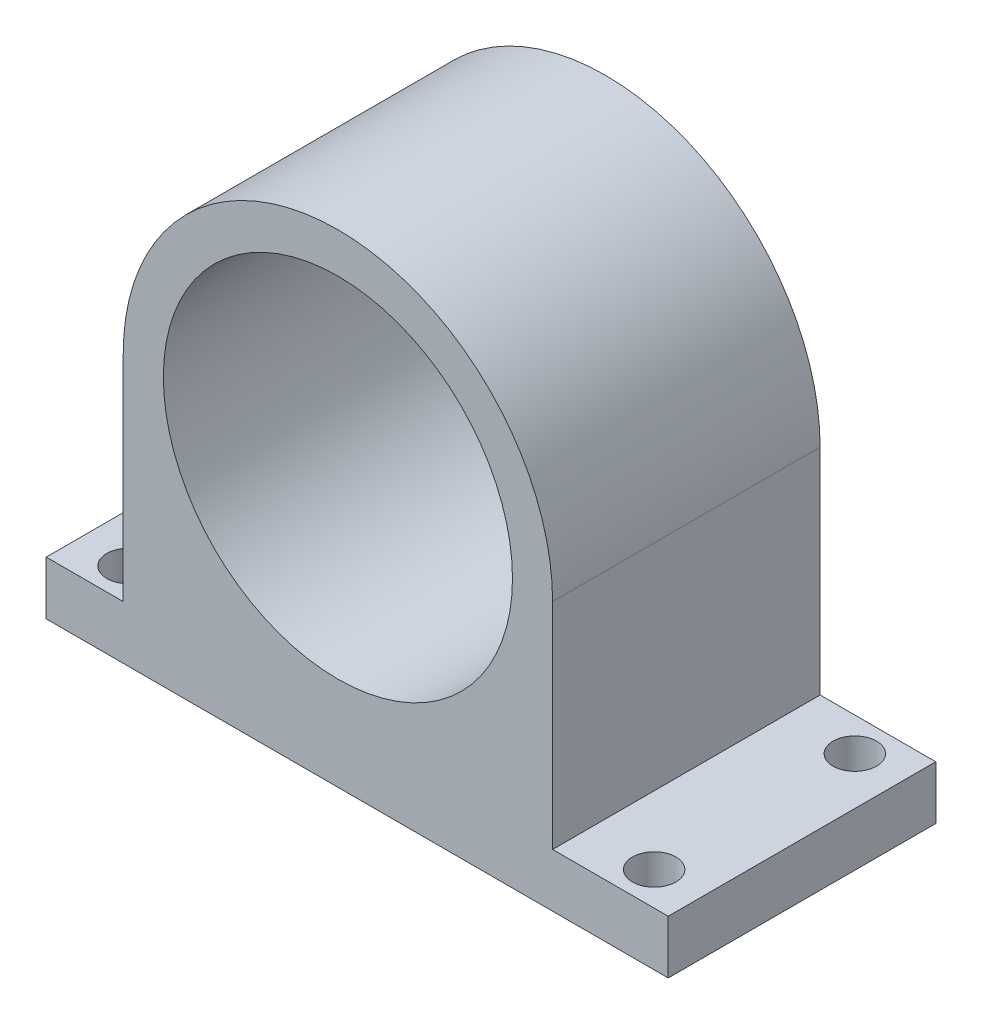
ISO-10303-21;
HEADER;
FILE_DESCRIPTION(('STEP AP214'),'2;1');
FILE_NAME('part.step','',(''),(''),'','','');
FILE_SCHEMA(('AUTOMOTIVE_DESIGN { 1 0 10303 214 1 1 1 1 }'));
ENDSEC;
DATA;
#1=APPLICATION_CONTEXT('core data for automotive mechanical design processes');
#2=APPLICATION_PROTOCOL_DEFINITION('international standard','automotive_design',2000,#1);
#3=PRODUCT_CONTEXT('',#1,'mechanical');
#4=PRODUCT('Part','Part','',(#3));
#5=PRODUCT_RELATED_PRODUCT_CATEGORY('part','',(#4));
#6=PRODUCT_DEFINITION_FORMATION('','',#4);
#7=PRODUCT_DEFINITION_CONTEXT('part definition',#1,'design');
#8=PRODUCT_DEFINITION('design','',#6,#7);
#9=PRODUCT_DEFINITION_SHAPE('','',#8);
#10=(LENGTH_UNIT() NAMED_UNIT(*) SI_UNIT(.MILLI.,.METRE.));
#11=(NAMED_UNIT(*) PLANE_ANGLE_UNIT() SI_UNIT($,.RADIAN.));
#12=(NAMED_UNIT(*) SI_UNIT($,.STERADIAN.) SOLID_ANGLE_UNIT());
#13=UNCERTAINTY_MEASURE_WITH_UNIT(LENGTH_MEASURE(1.E-05),#10,'distance_accuracy_value','');
#14=(GEOMETRIC_REPRESENTATION_CONTEXT(3) GLOBAL_UNCERTAINTY_ASSIGNED_CONTEXT((#13)) GLOBAL_UNIT_ASSIGNED_CONTEXT((#10,
#11,#12)) REPRESENTATION_CONTEXT('',''));
#15=CARTESIAN_POINT('',(0.,0.,0.));
#16=DIRECTION('',(0.,0.,1.));
#17=DIRECTION('',(1.,0.,0.));
#18=AXIS2_PLACEMENT_3D('',#15,#16,#17);
#19=CARTESIAN_POINT('',(0.,0.,40.));
#20=DIRECTION('',(0.,0.,1.));
#21=DIRECTION('',(1.,0.,0.));
#22=AXIS2_PLACEMENT_3D('',#19,#20,#21);
#23=PLANE('',#22);
#24=DIRECTION('',(0.,-1.,0.));
#25=VECTOR('',#24,1.);
#26=CARTESIAN_POINT('',(-43.6113587860518,-32.1,40.));
#27=LINE('',#26,#25);
#28=CARTESIAN_POINT('',(-43.6113587860518,-32.1,40.));
#29=VERTEX_POINT('',#28);
#30=CARTESIAN_POINT('',(-43.6113587860518,-40.1,40.));
#31=VERTEX_POINT('',#30);
#32=EDGE_CURVE('E145',#29,#31,#27,.T.);
#33=ORIENTED_EDGE('',*,*,#32,.T.);
#34=DIRECTION('',(1.,0.,0.));
#35=VECTOR('',#34,1.);
#36=CARTESIAN_POINT('',(-43.6113587860518,-40.1,40.));
#37=LINE('',#36,#35);
#38=CARTESIAN_POINT('',(49.3886412139482,-40.1,40.));
#39=VERTEX_POINT('',#38);
#40=EDGE_CURVE('E93',#31,#39,#37,.T.);
#41=ORIENTED_EDGE('',*,*,#40,.T.);
#42=DIRECTION('',(0.,1.,0.));
#43=VECTOR('',#42,1.);
#44=CARTESIAN_POINT('',(49.3886412139482,-32.1,40.));
#45=LINE('',#44,#43);
#46=CARTESIAN_POINT('',(49.3886412139482,-32.1,40.));
#47=VERTEX_POINT('',#46);
#48=EDGE_CURVE('E160',#39,#47,#45,.T.);
#49=ORIENTED_EDGE('',*,*,#48,.T.);
#50=DIRECTION('',(-1.,0.,0.));
#51=VECTOR('',#50,1.);
#52=CARTESIAN_POINT('',(32.1,-32.1,40.));
#53=LINE('',#52,#51);
#54=CARTESIAN_POINT('',(32.1,-32.1,40.));
#55=VERTEX_POINT('',#54);
#56=EDGE_CURVE('E173',#47,#55,#53,.T.);
#57=ORIENTED_EDGE('',*,*,#56,.T.);
#58=DIRECTION('',(0.,1.,0.));
#59=VECTOR('',#58,1.);
#60=CARTESIAN_POINT('',(32.1,0.,40.));
#61=LINE('',#60,#59);
#62=CARTESIAN_POINT('',(32.1,0.,40.));
#63=VERTEX_POINT('',#62);
#64=EDGE_CURVE('E112',#55,#63,#61,.T.);
#65=ORIENTED_EDGE('',*,*,#64,.T.);
#66=CARTESIAN_POINT('',(0.,0.,40.));
#67=DIRECTION('',(0.,0.,1.));
#68=DIRECTION('',(1.,0.,0.));
#69=AXIS2_PLACEMENT_3D('',#66,#67,#68);
#70=CIRCLE('',#69,32.1);
#71=CARTESIAN_POINT('',(-32.1,0.,40.));
#72=VERTEX_POINT('',#71);
#73=EDGE_CURVE('E106',#63,#72,#70,.T.);
#74=ORIENTED_EDGE('',*,*,#73,.T.);
#75=DIRECTION('',(0.,-1.,0.));
#76=VECTOR('',#75,1.);
#77=CARTESIAN_POINT('',(-32.1,0.,40.));
#78=LINE('',#77,#76);
#79=CARTESIAN_POINT('',(-32.1,-32.1,40.));
#80=VERTEX_POINT('',#79);
#81=EDGE_CURVE('E110',#72,#80,#78,.T.);
#82=ORIENTED_EDGE('',*,*,#81,.T.);
#83=DIRECTION('',(-1.,0.,0.));
#84=VECTOR('',#83,1.);
#85=CARTESIAN_POINT('',(-43.6113587860518,-32.1,40.));
#86=LINE('',#85,#84);
#87=EDGE_CURVE('E50',#80,#29,#86,.T.);
#88=ORIENTED_EDGE('',*,*,#87,.T.);
#89=EDGE_LOOP('',(#33,#41,#49,#57,#65,#74,#82,#88));
#90=FACE_BOUND('',#89,.T.);
#91=CARTESIAN_POINT('',(0.,0.,40.));
#92=DIRECTION('',(0.,0.,1.));
#93=DIRECTION('',(1.,0.,0.));
#94=AXIS2_PLACEMENT_3D('',#91,#92,#93);
#95=CIRCLE('',#94,26.1);
#96=CARTESIAN_POINT('',(26.1,0.,40.));
#97=VERTEX_POINT('',#96);
#98=EDGE_CURVE('E134',#97,#97,#95,.T.);
#99=ORIENTED_EDGE('',*,*,#98,.F.);
#100=EDGE_LOOP('',(#99));
#101=FACE_BOUND('',#100,.T.);
#102=ADVANCED_FACE('F33',(#90,#101),#23,.T.);
#103=CARTESIAN_POINT('',(0.,0.,0.));
#104=DIRECTION('',(0.,0.,1.));
#105=DIRECTION('',(1.,0.,0.));
#106=AXIS2_PLACEMENT_3D('',#103,#104,#105);
#107=PLANE('',#106);
#108=DIRECTION('',(0.,-1.,0.));
#109=VECTOR('',#108,1.);
#110=CARTESIAN_POINT('',(-43.6113587860518,-32.1,0.));
#111=LINE('',#110,#109);
#112=CARTESIAN_POINT('',(-43.6113587860518,-32.1,0.));
#113=VERTEX_POINT('',#112);
#114=CARTESIAN_POINT('',(-43.6113587860518,-40.1,0.));
#115=VERTEX_POINT('',#114);
#116=EDGE_CURVE('E130',#113,#115,#111,.T.);
#117=ORIENTED_EDGE('',*,*,#116,.F.);
#118=DIRECTION('',(-1.,0.,0.));
#119=VECTOR('',#118,1.);
#120=CARTESIAN_POINT('',(-43.6113587860518,-32.1,0.));
#121=LINE('',#120,#119);
#122=CARTESIAN_POINT('',(-32.1,-32.1,0.));
#123=VERTEX_POINT('',#122);
#124=EDGE_CURVE('E85',#123,#113,#121,.T.);
#125=ORIENTED_EDGE('',*,*,#124,.F.);
#126=DIRECTION('',(0.,-1.,0.));
#127=VECTOR('',#126,1.);
#128=CARTESIAN_POINT('',(-32.1,0.,0.));
#129=LINE('',#128,#127);
#130=CARTESIAN_POINT('',(-32.1,0.,0.));
#131=VERTEX_POINT('',#130);
#132=EDGE_CURVE('E79',#131,#123,#129,.T.);
#133=ORIENTED_EDGE('',*,*,#132,.F.);
#134=CARTESIAN_POINT('',(0.,0.,0.));
#135=DIRECTION('',(0.,0.,1.));
#136=DIRECTION('',(1.,0.,0.));
#137=AXIS2_PLACEMENT_3D('',#134,#135,#136);
#138=CIRCLE('',#137,32.1);
#139=CARTESIAN_POINT('',(32.1,0.,0.));
#140=VERTEX_POINT('',#139);
#141=EDGE_CURVE('E120',#140,#131,#138,.T.);
#142=ORIENTED_EDGE('',*,*,#141,.F.);
#143=DIRECTION('',(0.,1.,0.));
#144=VECTOR('',#143,1.);
#145=CARTESIAN_POINT('',(32.1,0.,0.));
#146=LINE('',#145,#144);
#147=CARTESIAN_POINT('',(32.1,-32.1,0.));
#148=VERTEX_POINT('',#147);
#149=EDGE_CURVE('E140',#148,#140,#146,.T.);
#150=ORIENTED_EDGE('',*,*,#149,.F.);
#151=DIRECTION('',(-1.,0.,0.));
#152=VECTOR('',#151,1.);
#153=CARTESIAN_POINT('',(32.1,-32.1,0.));
#154=LINE('',#153,#152);
#155=CARTESIAN_POINT('',(49.3886412139482,-32.1,0.));
#156=VERTEX_POINT('',#155);
#157=EDGE_CURVE('E138',#156,#148,#154,.T.);
#158=ORIENTED_EDGE('',*,*,#157,.F.);
#159=DIRECTION('',(0.,1.,0.));
#160=VECTOR('',#159,1.);
#161=CARTESIAN_POINT('',(49.3886412139482,-32.1,0.));
#162=LINE('',#161,#160);
#163=CARTESIAN_POINT('',(49.3886412139482,-40.1,0.));
#164=VERTEX_POINT('',#163);
#165=EDGE_CURVE('E136',#164,#156,#162,.T.);
#166=ORIENTED_EDGE('',*,*,#165,.F.);
#167=DIRECTION('',(1.,0.,0.));
#168=VECTOR('',#167,1.);
#169=CARTESIAN_POINT('',(-43.6113587860518,-40.1,0.));
#170=LINE('',#169,#168);
#171=EDGE_CURVE('E133',#115,#164,#170,.T.);
#172=ORIENTED_EDGE('',*,*,#171,.F.);
#173=EDGE_LOOP('',(#117,#125,#133,#142,#150,#158,#166,#172));
#174=FACE_BOUND('',#173,.T.);
#175=CARTESIAN_POINT('',(0.,0.,0.));
#176=DIRECTION('',(0.,0.,1.));
#177=DIRECTION('',(1.,0.,0.));
#178=AXIS2_PLACEMENT_3D('',#175,#176,#177);
#179=CIRCLE('',#178,26.1);
#180=CARTESIAN_POINT('',(26.1,0.,0.));
#181=VERTEX_POINT('',#180);
#182=EDGE_CURVE('E179',#181,#181,#179,.T.);
#183=ORIENTED_EDGE('',*,*,#182,.T.);
#184=EDGE_LOOP('',(#183));
#185=FACE_BOUND('',#184,.T.);
#186=ADVANCED_FACE('F164',(#174,#185),#107,.F.);
#187=CARTESIAN_POINT('',(-43.6113587860518,-32.1,40.));
#188=DIRECTION('',(1.,0.,0.));
#189=DIRECTION('',(0.,0.,-1.));
#190=AXIS2_PLACEMENT_3D('',#187,#188,#189);
#191=PLANE('',#190);
#192=ORIENTED_EDGE('',*,*,#116,.T.);
#193=DIRECTION('',(0.,0.,-1.));
#194=VECTOR('',#193,1.);
#195=CARTESIAN_POINT('',(-43.6113587860518,-40.1,40.));
#196=LINE('',#195,#194);
#197=EDGE_CURVE('E11',#31,#115,#196,.T.);
#198=ORIENTED_EDGE('',*,*,#197,.F.);
#199=ORIENTED_EDGE('',*,*,#32,.F.);
#200=DIRECTION('',(0.,0.,-1.));
#201=VECTOR('',#200,1.);
#202=CARTESIAN_POINT('',(-43.6113587860518,-32.1,40.));
#203=LINE('',#202,#201);
#204=EDGE_CURVE('E126',#29,#113,#203,.T.);
#205=ORIENTED_EDGE('',*,*,#204,.T.);
#206=EDGE_LOOP('',(#192,#198,#199,#205));
#207=FACE_BOUND('',#206,.T.);
#208=ADVANCED_FACE('F35',(#207),#191,.F.);
#209=CARTESIAN_POINT('',(-43.6113587860518,-40.1,40.));
#210=DIRECTION('',(0.,1.,0.));
#211=DIRECTION('',(-1.,0.,0.));
#212=AXIS2_PLACEMENT_3D('',#209,#210,#211);
#213=PLANE('',#212);
#214=CARTESIAN_POINT('',(42.2851581234396,-40.1,5.));
#215=DIRECTION('',(0.,1.,0.));
#216=DIRECTION('',(0.,0.,1.));
#217=AXIS2_PLACEMENT_3D('',#214,#215,#216);
#218=CIRCLE('',#217,3.25);
#219=CARTESIAN_POINT('',(42.2851581234396,-40.1,8.24999999999999));
#220=VERTEX_POINT('',#219);
#221=EDGE_CURVE('E202',#220,#220,#218,.T.);
#222=ORIENTED_EDGE('',*,*,#221,.T.);
#223=EDGE_LOOP('',(#222));
#224=FACE_BOUND('',#223,.T.);
#225=CARTESIAN_POINT('',(42.2851581234396,-40.1,35.));
#226=DIRECTION('',(0.,1.,0.));
#227=DIRECTION('',(0.,0.,1.));
#228=AXIS2_PLACEMENT_3D('',#225,#226,#227);
#229=CIRCLE('',#228,3.25);
#230=CARTESIAN_POINT('',(42.2851581234396,-40.1,38.25));
#231=VERTEX_POINT('',#230);
#232=EDGE_CURVE('E196',#231,#231,#229,.T.);
#233=ORIENTED_EDGE('',*,*,#232,.T.);
#234=EDGE_LOOP('',(#233));
#235=FACE_BOUND('',#234,.T.);
#236=CARTESIAN_POINT('',(-36.3148418765604,-40.1,35.));
#237=DIRECTION('',(0.,1.,0.));
#238=DIRECTION('',(0.,0.,1.));
#239=AXIS2_PLACEMENT_3D('',#236,#237,#238);
#240=CIRCLE('',#239,3.25);
#241=CARTESIAN_POINT('',(-36.3148418765604,-40.1,38.25));
#242=VERTEX_POINT('',#241);
#243=EDGE_CURVE('E190',#242,#242,#240,.T.);
#244=ORIENTED_EDGE('',*,*,#243,.T.);
#245=EDGE_LOOP('',(#244));
#246=FACE_BOUND('',#245,.T.);
#247=CARTESIAN_POINT('',(-36.3148418765604,-40.1,5.));
#248=DIRECTION('',(0.,1.,0.));
#249=DIRECTION('',(0.,0.,1.));
#250=AXIS2_PLACEMENT_3D('',#247,#248,#249);
#251=CIRCLE('',#250,3.25);
#252=CARTESIAN_POINT('',(-36.3148418765604,-40.1,8.25));
#253=VERTEX_POINT('',#252);
#254=EDGE_CURVE('E182',#253,#253,#251,.T.);
#255=ORIENTED_EDGE('',*,*,#254,.T.);
#256=EDGE_LOOP('',(#255));
#257=FACE_BOUND('',#256,.T.);
#258=ORIENTED_EDGE('',*,*,#171,.T.);
#259=DIRECTION('',(0.,0.,-1.));
#260=VECTOR('',#259,1.);
#261=CARTESIAN_POINT('',(49.3886412139482,-40.1,40.));
#262=LINE('',#261,#260);
#263=EDGE_CURVE('E42',#39,#164,#262,.T.);
#264=ORIENTED_EDGE('',*,*,#263,.F.);
#265=ORIENTED_EDGE('',*,*,#40,.F.);
#266=ORIENTED_EDGE('',*,*,#197,.T.);
#267=EDGE_LOOP('',(#258,#264,#265,#266));
#268=FACE_BOUND('',#267,.T.);
#269=ADVANCED_FACE('F252',(#224,#235,#246,#257,#268),#213,.F.);
#270=CARTESIAN_POINT('',(49.3886412139482,-32.1,40.));
#271=DIRECTION('',(-1.,0.,0.));
#272=DIRECTION('',(0.,0.,1.));
#273=AXIS2_PLACEMENT_3D('',#270,#271,#272);
#274=PLANE('',#273);
#275=ORIENTED_EDGE('',*,*,#165,.T.);
#276=DIRECTION('',(0.,0.,-1.));
#277=VECTOR('',#276,1.);
#278=CARTESIAN_POINT('',(49.3886412139482,-32.1,40.));
#279=LINE('',#278,#277);
#280=EDGE_CURVE('E152',#47,#156,#279,.T.);
#281=ORIENTED_EDGE('',*,*,#280,.F.);
#282=ORIENTED_EDGE('',*,*,#48,.F.);
#283=ORIENTED_EDGE('',*,*,#263,.T.);
#284=EDGE_LOOP('',(#275,#281,#282,#283));
#285=FACE_BOUND('',#284,.T.);
#286=ADVANCED_FACE('F158',(#285),#274,.F.);
#287=CARTESIAN_POINT('',(32.1,-32.1,40.));
#288=DIRECTION('',(0.,-1.,0.));
#289=DIRECTION('',(0.,0.,-1.));
#290=AXIS2_PLACEMENT_3D('',#287,#288,#289);
#291=PLANE('',#290);
#292=CARTESIAN_POINT('',(42.2851581234396,-32.1,5.));
#293=DIRECTION('',(0.,1.,0.));
#294=DIRECTION('',(0.,0.,1.));
#295=AXIS2_PLACEMENT_3D('',#292,#293,#294);
#296=CIRCLE('',#295,3.25);
#297=CARTESIAN_POINT('',(42.2851581234396,-32.1,8.25));
#298=VERTEX_POINT('',#297);
#299=EDGE_CURVE('E205',#298,#298,#296,.T.);
#300=ORIENTED_EDGE('',*,*,#299,.F.);
#301=EDGE_LOOP('',(#300));
#302=FACE_BOUND('',#301,.T.);
#303=CARTESIAN_POINT('',(42.2851581234396,-32.1,35.));
#304=DIRECTION('',(0.,1.,0.));
#305=DIRECTION('',(0.,0.,1.));
#306=AXIS2_PLACEMENT_3D('',#303,#304,#305);
#307=CIRCLE('',#306,3.25);
#308=CARTESIAN_POINT('',(42.2851581234396,-32.1,38.25));
#309=VERTEX_POINT('',#308);
#310=EDGE_CURVE('E199',#309,#309,#307,.T.);
#311=ORIENTED_EDGE('',*,*,#310,.F.);
#312=EDGE_LOOP('',(#311));
#313=FACE_BOUND('',#312,.T.);
#314=ORIENTED_EDGE('',*,*,#157,.T.);
#315=DIRECTION('',(0.,0.,-1.));
#316=VECTOR('',#315,1.);
#317=CARTESIAN_POINT('',(32.1,-32.1,40.));
#318=LINE('',#317,#316);
#319=EDGE_CURVE('E149',#55,#148,#318,.T.);
#320=ORIENTED_EDGE('',*,*,#319,.F.);
#321=ORIENTED_EDGE('',*,*,#56,.F.);
#322=ORIENTED_EDGE('',*,*,#280,.T.);
#323=EDGE_LOOP('',(#314,#320,#321,#322));
#324=FACE_BOUND('',#323,.T.);
#325=ADVANCED_FACE('F169',(#302,#313,#324),#291,.F.);
#326=CARTESIAN_POINT('',(32.1,0.,40.));
#327=DIRECTION('',(-1.,0.,0.));
#328=DIRECTION('',(0.,-1.,0.));
#329=AXIS2_PLACEMENT_3D('',#326,#327,#328);
#330=PLANE('',#329);
#331=ORIENTED_EDGE('',*,*,#149,.T.);
#332=DIRECTION('',(0.,0.,-1.));
#333=VECTOR('',#332,1.);
#334=CARTESIAN_POINT('',(32.1,0.,40.));
#335=LINE('',#334,#333);
#336=EDGE_CURVE('E121',#63,#140,#335,.T.);
#337=ORIENTED_EDGE('',*,*,#336,.F.);
#338=ORIENTED_EDGE('',*,*,#64,.F.);
#339=ORIENTED_EDGE('',*,*,#319,.T.);
#340=EDGE_LOOP('',(#331,#337,#338,#339));
#341=FACE_BOUND('',#340,.T.);
#342=ADVANCED_FACE('F172',(#341),#330,.F.);
#343=CARTESIAN_POINT('',(0.,0.,40.));
#344=DIRECTION('',(0.,0.,-1.));
#345=DIRECTION('',(-1.,0.,0.));
#346=AXIS2_PLACEMENT_3D('',#343,#344,#345);
#347=CYLINDRICAL_SURFACE('',#346,32.1);
#348=ORIENTED_EDGE('',*,*,#141,.T.);
#349=DIRECTION('',(0.,0.,-1.));
#350=VECTOR('',#349,1.);
#351=CARTESIAN_POINT('',(-32.1,0.,40.));
#352=LINE('',#351,#350);
#353=EDGE_CURVE('E117',#72,#131,#352,.T.);
#354=ORIENTED_EDGE('',*,*,#353,.F.);
#355=ORIENTED_EDGE('',*,*,#73,.F.);
#356=ORIENTED_EDGE('',*,*,#336,.T.);
#357=EDGE_LOOP('',(#348,#354,#355,#356));
#358=FACE_BOUND('',#357,.T.);
#359=ADVANCED_FACE('F118',(#358),#347,.T.);
#360=CARTESIAN_POINT('',(-32.1,0.,40.));
#361=DIRECTION('',(1.,0.,0.));
#362=DIRECTION('',(0.,0.,-1.));
#363=AXIS2_PLACEMENT_3D('',#360,#361,#362);
#364=PLANE('',#363);
#365=ORIENTED_EDGE('',*,*,#132,.T.);
#366=DIRECTION('',(0.,0.,-1.));
#367=VECTOR('',#366,1.);
#368=CARTESIAN_POINT('',(-32.1,-32.1,40.));
#369=LINE('',#368,#367);
#370=EDGE_CURVE('E122',#80,#123,#369,.T.);
#371=ORIENTED_EDGE('',*,*,#370,.F.);
#372=ORIENTED_EDGE('',*,*,#81,.F.);
#373=ORIENTED_EDGE('',*,*,#353,.T.);
#374=EDGE_LOOP('',(#365,#371,#372,#373));
#375=FACE_BOUND('',#374,.T.);
#376=ADVANCED_FACE('F124',(#375),#364,.F.);
#377=CARTESIAN_POINT('',(-43.6113587860518,-32.1,40.));
#378=DIRECTION('',(0.,-1.,0.));
#379=DIRECTION('',(0.,0.,-1.));
#380=AXIS2_PLACEMENT_3D('',#377,#378,#379);
#381=PLANE('',#380);
#382=CARTESIAN_POINT('',(-36.3148418765604,-32.1,35.));
#383=DIRECTION('',(0.,1.,0.));
#384=DIRECTION('',(0.,0.,1.));
#385=AXIS2_PLACEMENT_3D('',#382,#383,#384);
#386=CIRCLE('',#385,3.25);
#387=CARTESIAN_POINT('',(-36.3148418765604,-32.1,38.25));
#388=VERTEX_POINT('',#387);
#389=EDGE_CURVE('E193',#388,#388,#386,.T.);
#390=ORIENTED_EDGE('',*,*,#389,.F.);
#391=EDGE_LOOP('',(#390));
#392=FACE_BOUND('',#391,.T.);
#393=CARTESIAN_POINT('',(-36.3148418765604,-32.1,5.));
#394=DIRECTION('',(0.,1.,0.));
#395=DIRECTION('',(0.,0.,1.));
#396=AXIS2_PLACEMENT_3D('',#393,#394,#395);
#397=CIRCLE('',#396,3.25);
#398=CARTESIAN_POINT('',(-36.3148418765604,-32.1,8.25000000000001));
#399=VERTEX_POINT('',#398);
#400=EDGE_CURVE('E187',#399,#399,#397,.T.);
#401=ORIENTED_EDGE('',*,*,#400,.F.);
#402=EDGE_LOOP('',(#401));
#403=FACE_BOUND('',#402,.T.);
#404=ORIENTED_EDGE('',*,*,#124,.T.);
#405=ORIENTED_EDGE('',*,*,#204,.F.);
#406=ORIENTED_EDGE('',*,*,#87,.F.);
#407=ORIENTED_EDGE('',*,*,#370,.T.);
#408=EDGE_LOOP('',(#404,#405,#406,#407));
#409=FACE_BOUND('',#408,.T.);
#410=ADVANCED_FACE('F241',(#392,#403,#409),#381,.F.);
#411=CARTESIAN_POINT('',(0.,0.,40.));
#412=DIRECTION('',(0.,0.,-1.));
#413=DIRECTION('',(-1.,0.,0.));
#414=AXIS2_PLACEMENT_3D('',#411,#412,#413);
#415=CYLINDRICAL_SURFACE('',#414,26.1);
#416=ORIENTED_EDGE('',*,*,#98,.T.);
#417=EDGE_LOOP('',(#416));
#418=FACE_BOUND('',#417,.T.);
#419=ORIENTED_EDGE('',*,*,#182,.F.);
#420=EDGE_LOOP('',(#419));
#421=FACE_BOUND('',#420,.T.);
#422=ADVANCED_FACE('F238',(#418,#421),#415,.F.);
#423=CARTESIAN_POINT('',(-36.3148418765604,-32.1,5.));
#424=DIRECTION('',(0.,1.,0.));
#425=DIRECTION('',(0.,0.,1.));
#426=AXIS2_PLACEMENT_3D('',#423,#424,#425);
#427=CYLINDRICAL_SURFACE('',#426,3.25);
#428=ORIENTED_EDGE('',*,*,#254,.F.);
#429=EDGE_LOOP('',(#428));
#430=FACE_BOUND('',#429,.T.);
#431=ORIENTED_EDGE('',*,*,#400,.T.);
#432=EDGE_LOOP('',(#431));
#433=FACE_BOUND('',#432,.T.);
#434=ADVANCED_FACE('F227',(#430,#433),#427,.F.);
#435=CARTESIAN_POINT('',(-36.3148418765604,-32.1,35.));
#436=DIRECTION('',(0.,1.,0.));
#437=DIRECTION('',(0.,0.,1.));
#438=AXIS2_PLACEMENT_3D('',#435,#436,#437);
#439=CYLINDRICAL_SURFACE('',#438,3.25);
#440=ORIENTED_EDGE('',*,*,#243,.F.);
#441=EDGE_LOOP('',(#440));
#442=FACE_BOUND('',#441,.T.);
#443=ORIENTED_EDGE('',*,*,#389,.T.);
#444=EDGE_LOOP('',(#443));
#445=FACE_BOUND('',#444,.T.);
#446=ADVANCED_FACE('F218',(#442,#445),#439,.F.);
#447=CARTESIAN_POINT('',(42.2851581234396,-32.1,35.));
#448=DIRECTION('',(0.,1.,0.));
#449=DIRECTION('',(0.,0.,1.));
#450=AXIS2_PLACEMENT_3D('',#447,#448,#449);
#451=CYLINDRICAL_SURFACE('',#450,3.25);
#452=ORIENTED_EDGE('',*,*,#232,.F.);
#453=EDGE_LOOP('',(#452));
#454=FACE_BOUND('',#453,.T.);
#455=ORIENTED_EDGE('',*,*,#310,.T.);
#456=EDGE_LOOP('',(#455));
#457=FACE_BOUND('',#456,.T.);
#458=ADVANCED_FACE('F216',(#454,#457),#451,.F.);
#459=CARTESIAN_POINT('',(42.2851581234396,-32.1,5.));
#460=DIRECTION('',(0.,1.,0.));
#461=DIRECTION('',(0.,0.,1.));
#462=AXIS2_PLACEMENT_3D('',#459,#460,#461);
#463=CYLINDRICAL_SURFACE('',#462,3.25);
#464=ORIENTED_EDGE('',*,*,#221,.F.);
#465=EDGE_LOOP('',(#464));
#466=FACE_BOUND('',#465,.T.);
#467=ORIENTED_EDGE('',*,*,#299,.T.);
#468=EDGE_LOOP('',(#467));
#469=FACE_BOUND('',#468,.T.);
#470=ADVANCED_FACE('F209',(#466,#469),#463,.F.);
#471=CLOSED_SHELL('',(#102,#186,#208,#269,#286,#325,#342,#359,#376,#410,#422,#434,#446,#458,#470));
#472=MANIFOLD_SOLID_BREP('B2',#471);
#473=ADVANCED_BREP_SHAPE_REPRESENTATION('',(#18,#472),#14);
#474=SHAPE_DEFINITION_REPRESENTATION(#9,#473);
ENDSEC;
END-ISO-10303-21;
